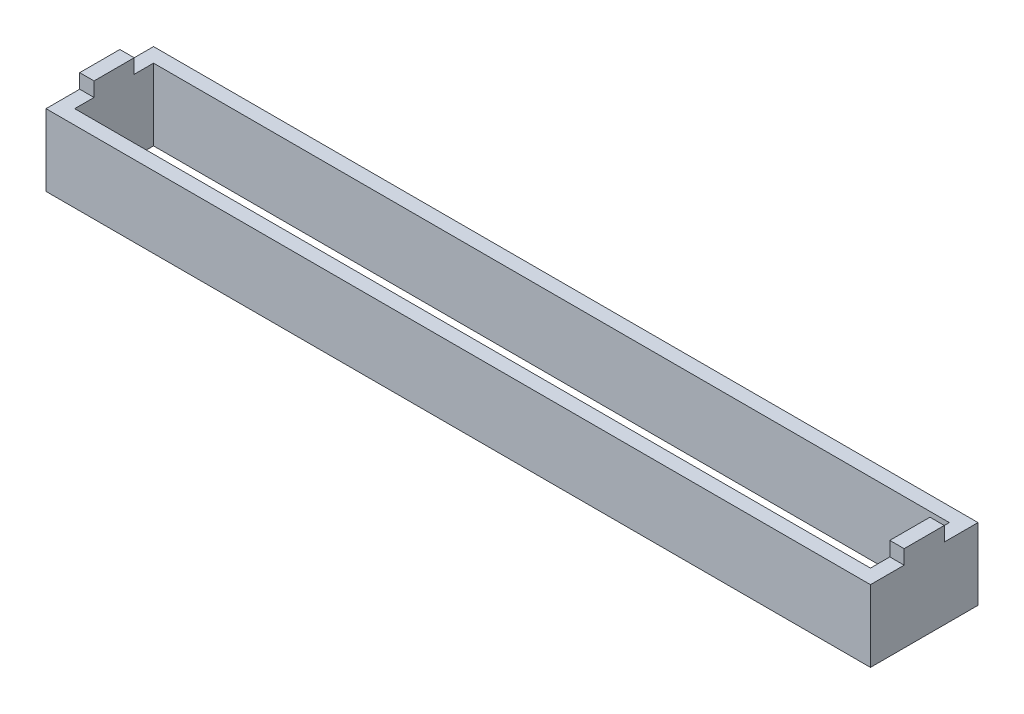
ISO-10303-21;
HEADER;
FILE_DESCRIPTION(('STEP AP214'),'2;1');
FILE_NAME('part.step','',(''),(''),'','','');
FILE_SCHEMA(('AUTOMOTIVE_DESIGN { 1 0 10303 214 1 1 1 1 }'));
ENDSEC;
DATA;
#1=APPLICATION_CONTEXT('core data for automotive mechanical design processes');
#2=APPLICATION_PROTOCOL_DEFINITION('international standard','automotive_design',2000,#1);
#3=PRODUCT_CONTEXT('',#1,'mechanical');
#4=PRODUCT('Part','Part','',(#3));
#5=PRODUCT_RELATED_PRODUCT_CATEGORY('part','',(#4));
#6=PRODUCT_DEFINITION_FORMATION('','',#4);
#7=PRODUCT_DEFINITION_CONTEXT('part definition',#1,'design');
#8=PRODUCT_DEFINITION('design','',#6,#7);
#9=PRODUCT_DEFINITION_SHAPE('','',#8);
#10=(LENGTH_UNIT() NAMED_UNIT(*) SI_UNIT(.MILLI.,.METRE.));
#11=(NAMED_UNIT(*) PLANE_ANGLE_UNIT() SI_UNIT($,.RADIAN.));
#12=(NAMED_UNIT(*) SI_UNIT($,.STERADIAN.) SOLID_ANGLE_UNIT());
#13=UNCERTAINTY_MEASURE_WITH_UNIT(LENGTH_MEASURE(1.E-05),#10,'distance_accuracy_value','');
#14=(GEOMETRIC_REPRESENTATION_CONTEXT(3) GLOBAL_UNCERTAINTY_ASSIGNED_CONTEXT((#13)) GLOBAL_UNIT_ASSIGNED_CONTEXT((#10,
#11,#12)) REPRESENTATION_CONTEXT('',''));
#15=CARTESIAN_POINT('',(0.,0.,0.));
#16=DIRECTION('',(0.,0.,1.));
#17=DIRECTION('',(1.,0.,0.));
#18=AXIS2_PLACEMENT_3D('',#15,#16,#17);
#19=CARTESIAN_POINT('',(0.,10.,0.));
#20=DIRECTION('',(0.,-1.,0.));
#21=DIRECTION('',(0.,0.,-1.));
#22=AXIS2_PLACEMENT_3D('',#19,#20,#21);
#23=PLANE('',#22);
#24=DIRECTION('',(1.,0.,0.));
#25=VECTOR('',#24,1.);
#26=CARTESIAN_POINT('',(55.5,10.,2.8));
#27=LINE('',#26,#25);
#28=CARTESIAN_POINT('',(55.5,10.,2.8));
#29=VERTEX_POINT('',#28);
#30=CARTESIAN_POINT('',(57.5,10.,2.8));
#31=VERTEX_POINT('',#30);
#32=EDGE_CURVE('E283',#29,#31,#27,.T.);
#33=ORIENTED_EDGE('',*,*,#32,.F.);
#34=DIRECTION('',(0.,0.,-1.));
#35=VECTOR('',#34,1.);
#36=CARTESIAN_POINT('',(55.5,10.,5.5));
#37=LINE('',#36,#35);
#38=CARTESIAN_POINT('',(55.5,10.,5.5));
#39=VERTEX_POINT('',#38);
#40=EDGE_CURVE('E174',#39,#29,#37,.T.);
#41=ORIENTED_EDGE('',*,*,#40,.F.);
#42=DIRECTION('',(1.,0.,0.));
#43=VECTOR('',#42,1.);
#44=CARTESIAN_POINT('',(-55.5,10.,5.5));
#45=LINE('',#44,#43);
#46=CARTESIAN_POINT('',(-55.5,10.,5.5));
#47=VERTEX_POINT('',#46);
#48=EDGE_CURVE('E213',#47,#39,#45,.T.);
#49=ORIENTED_EDGE('',*,*,#48,.F.);
#50=DIRECTION('',(0.,0.,1.));
#51=VECTOR('',#50,1.);
#52=CARTESIAN_POINT('',(-55.5,10.,5.5));
#53=LINE('',#52,#51);
#54=CARTESIAN_POINT('',(-55.5,10.,2.8));
#55=VERTEX_POINT('',#54);
#56=EDGE_CURVE('E210',#55,#47,#53,.T.);
#57=ORIENTED_EDGE('',*,*,#56,.F.);
#58=DIRECTION('',(1.,0.,0.));
#59=VECTOR('',#58,1.);
#60=CARTESIAN_POINT('',(-57.5,10.,2.8));
#61=LINE('',#60,#59);
#62=CARTESIAN_POINT('',(-57.5,10.,2.8));
#63=VERTEX_POINT('',#62);
#64=EDGE_CURVE('E175',#63,#55,#61,.T.);
#65=ORIENTED_EDGE('',*,*,#64,.F.);
#66=DIRECTION('',(0.,0.,1.));
#67=VECTOR('',#66,1.);
#68=CARTESIAN_POINT('',(-57.5,10.,7.5));
#69=LINE('',#68,#67);
#70=CARTESIAN_POINT('',(-57.5,10.,7.5));
#71=VERTEX_POINT('',#70);
#72=EDGE_CURVE('E243',#63,#71,#69,.T.);
#73=ORIENTED_EDGE('',*,*,#72,.T.);
#74=DIRECTION('',(1.,0.,0.));
#75=VECTOR('',#74,1.);
#76=CARTESIAN_POINT('',(-57.5,10.,7.5));
#77=LINE('',#76,#75);
#78=CARTESIAN_POINT('',(57.5,10.,7.5));
#79=VERTEX_POINT('',#78);
#80=EDGE_CURVE('E246',#71,#79,#77,.T.);
#81=ORIENTED_EDGE('',*,*,#80,.T.);
#82=DIRECTION('',(0.,0.,-1.));
#83=VECTOR('',#82,1.);
#84=CARTESIAN_POINT('',(57.5,10.,7.5));
#85=LINE('',#84,#83);
#86=EDGE_CURVE('E237',#79,#31,#85,.T.);
#87=ORIENTED_EDGE('',*,*,#86,.T.);
#88=EDGE_LOOP('',(#33,#41,#49,#57,#65,#73,#81,#87));
#89=FACE_BOUND('',#88,.T.);
#90=ADVANCED_FACE('F38',(#89),#23,.F.);
#91=DIRECTION('',(-1.,0.,0.));
#92=VECTOR('',#91,1.);
#93=CARTESIAN_POINT('',(55.5,10.,-2.8));
#94=LINE('',#93,#92);
#95=CARTESIAN_POINT('',(57.5,10.,-2.8));
#96=VERTEX_POINT('',#95);
#97=CARTESIAN_POINT('',(55.5,10.,-2.8));
#98=VERTEX_POINT('',#97);
#99=EDGE_CURVE('E168',#96,#98,#94,.T.);
#100=ORIENTED_EDGE('',*,*,#99,.F.);
#101=CARTESIAN_POINT('',(57.5,10.,-7.5));
#102=VERTEX_POINT('',#101);
#103=EDGE_CURVE('E241',#96,#102,#85,.T.);
#104=ORIENTED_EDGE('',*,*,#103,.T.);
#105=DIRECTION('',(-1.,0.,0.));
#106=VECTOR('',#105,1.);
#107=CARTESIAN_POINT('',(-57.5,10.,-7.5));
#108=LINE('',#107,#106);
#109=CARTESIAN_POINT('',(-57.5,10.,-7.5));
#110=VERTEX_POINT('',#109);
#111=EDGE_CURVE('E240',#102,#110,#108,.T.);
#112=ORIENTED_EDGE('',*,*,#111,.T.);
#113=CARTESIAN_POINT('',(-57.5,10.,-2.8));
#114=VERTEX_POINT('',#113);
#115=EDGE_CURVE('E244',#110,#114,#69,.T.);
#116=ORIENTED_EDGE('',*,*,#115,.T.);
#117=DIRECTION('',(-1.,0.,0.));
#118=VECTOR('',#117,1.);
#119=CARTESIAN_POINT('',(-57.5,10.,-2.8));
#120=LINE('',#119,#118);
#121=CARTESIAN_POINT('',(-55.5,10.,-2.8));
#122=VERTEX_POINT('',#121);
#123=EDGE_CURVE('E61',#122,#114,#120,.T.);
#124=ORIENTED_EDGE('',*,*,#123,.F.);
#125=CARTESIAN_POINT('',(-55.5,10.,-5.5));
#126=VERTEX_POINT('',#125);
#127=EDGE_CURVE('E211',#126,#122,#53,.T.);
#128=ORIENTED_EDGE('',*,*,#127,.F.);
#129=DIRECTION('',(-1.,0.,0.));
#130=VECTOR('',#129,1.);
#131=CARTESIAN_POINT('',(-55.5,10.,-5.5));
#132=LINE('',#131,#130);
#133=CARTESIAN_POINT('',(55.5,10.,-5.5));
#134=VERTEX_POINT('',#133);
#135=EDGE_CURVE('E207',#134,#126,#132,.T.);
#136=ORIENTED_EDGE('',*,*,#135,.F.);
#137=EDGE_CURVE('E208',#98,#134,#37,.T.);
#138=ORIENTED_EDGE('',*,*,#137,.F.);
#139=EDGE_LOOP('',(#100,#104,#112,#116,#124,#128,#136,#138));
#140=FACE_BOUND('',#139,.T.);
#141=ADVANCED_FACE('F304',(#140),#23,.F.);
#142=CARTESIAN_POINT('',(0.,0.,0.));
#143=DIRECTION('',(0.,-1.,0.));
#144=DIRECTION('',(0.,0.,-1.));
#145=AXIS2_PLACEMENT_3D('',#142,#143,#144);
#146=PLANE('',#145);
#147=DIRECTION('',(0.,0.,-1.));
#148=VECTOR('',#147,1.);
#149=CARTESIAN_POINT('',(57.5,0.,7.5));
#150=LINE('',#149,#148);
#151=CARTESIAN_POINT('',(57.5,0.,7.5));
#152=VERTEX_POINT('',#151);
#153=CARTESIAN_POINT('',(57.5,0.,-7.5));
#154=VERTEX_POINT('',#153);
#155=EDGE_CURVE('E236',#152,#154,#150,.T.);
#156=ORIENTED_EDGE('',*,*,#155,.F.);
#157=DIRECTION('',(1.,0.,0.));
#158=VECTOR('',#157,1.);
#159=CARTESIAN_POINT('',(-57.5,0.,7.5));
#160=LINE('',#159,#158);
#161=CARTESIAN_POINT('',(-57.5,0.,7.5));
#162=VERTEX_POINT('',#161);
#163=EDGE_CURVE('E255',#162,#152,#160,.T.);
#164=ORIENTED_EDGE('',*,*,#163,.F.);
#165=DIRECTION('',(0.,0.,1.));
#166=VECTOR('',#165,1.);
#167=CARTESIAN_POINT('',(-57.5,0.,7.5));
#168=LINE('',#167,#166);
#169=CARTESIAN_POINT('',(-57.5,0.,-7.5));
#170=VERTEX_POINT('',#169);
#171=EDGE_CURVE('E253',#170,#162,#168,.T.);
#172=ORIENTED_EDGE('',*,*,#171,.F.);
#173=DIRECTION('',(-1.,0.,0.));
#174=VECTOR('',#173,1.);
#175=CARTESIAN_POINT('',(-57.5,0.,-7.5));
#176=LINE('',#175,#174);
#177=EDGE_CURVE('E251',#154,#170,#176,.T.);
#178=ORIENTED_EDGE('',*,*,#177,.F.);
#179=EDGE_LOOP('',(#156,#164,#172,#178));
#180=FACE_BOUND('',#179,.T.);
#181=DIRECTION('',(1.,0.,0.));
#182=VECTOR('',#181,1.);
#183=CARTESIAN_POINT('',(-55.5,0.,5.5));
#184=LINE('',#183,#182);
#185=CARTESIAN_POINT('',(-55.5,0.,5.5));
#186=VERTEX_POINT('',#185);
#187=CARTESIAN_POINT('',(55.5,0.,5.5));
#188=VERTEX_POINT('',#187);
#189=EDGE_CURVE('E224',#186,#188,#184,.T.);
#190=ORIENTED_EDGE('',*,*,#189,.T.);
#191=DIRECTION('',(0.,0.,-1.));
#192=VECTOR('',#191,1.);
#193=CARTESIAN_POINT('',(55.5,0.,5.5));
#194=LINE('',#193,#192);
#195=CARTESIAN_POINT('',(55.5,0.,-5.5));
#196=VERTEX_POINT('',#195);
#197=EDGE_CURVE('E205',#188,#196,#194,.T.);
#198=ORIENTED_EDGE('',*,*,#197,.T.);
#199=DIRECTION('',(-1.,0.,0.));
#200=VECTOR('',#199,1.);
#201=CARTESIAN_POINT('',(-55.5,0.,-5.5));
#202=LINE('',#201,#200);
#203=CARTESIAN_POINT('',(-55.5,0.,-5.5));
#204=VERTEX_POINT('',#203);
#205=EDGE_CURVE('E218',#196,#204,#202,.T.);
#206=ORIENTED_EDGE('',*,*,#205,.T.);
#207=DIRECTION('',(0.,0.,1.));
#208=VECTOR('',#207,1.);
#209=CARTESIAN_POINT('',(-55.5,0.,5.5));
#210=LINE('',#209,#208);
#211=EDGE_CURVE('E221',#204,#186,#210,.T.);
#212=ORIENTED_EDGE('',*,*,#211,.T.);
#213=EDGE_LOOP('',(#190,#198,#206,#212));
#214=FACE_BOUND('',#213,.T.);
#215=ADVANCED_FACE('F273',(#180,#214),#146,.T.);
#216=CARTESIAN_POINT('',(57.5,10.,7.5));
#217=DIRECTION('',(-1.,0.,0.));
#218=DIRECTION('',(0.,0.,1.));
#219=AXIS2_PLACEMENT_3D('',#216,#217,#218);
#220=PLANE('',#219);
#221=ORIENTED_EDGE('',*,*,#155,.T.);
#222=DIRECTION('',(0.,-1.,0.));
#223=VECTOR('',#222,1.);
#224=CARTESIAN_POINT('',(57.5,10.,-7.5));
#225=LINE('',#224,#223);
#226=EDGE_CURVE('E11',#102,#154,#225,.T.);
#227=ORIENTED_EDGE('',*,*,#226,.F.);
#228=ORIENTED_EDGE('',*,*,#103,.F.);
#229=DIRECTION('',(0.,-1.,0.));
#230=VECTOR('',#229,1.);
#231=CARTESIAN_POINT('',(57.5,12.,-2.8));
#232=LINE('',#231,#230);
#233=CARTESIAN_POINT('',(57.5,12.,-2.8));
#234=VERTEX_POINT('',#233);
#235=EDGE_CURVE('E179',#234,#96,#232,.T.);
#236=ORIENTED_EDGE('',*,*,#235,.F.);
#237=DIRECTION('',(0.,0.,-1.));
#238=VECTOR('',#237,1.);
#239=CARTESIAN_POINT('',(57.5,12.,-2.8));
#240=LINE('',#239,#238);
#241=CARTESIAN_POINT('',(57.5,12.,2.8));
#242=VERTEX_POINT('',#241);
#243=EDGE_CURVE('E162',#242,#234,#240,.T.);
#244=ORIENTED_EDGE('',*,*,#243,.F.);
#245=DIRECTION('',(0.,-1.,0.));
#246=VECTOR('',#245,1.);
#247=CARTESIAN_POINT('',(57.5,12.,2.8));
#248=LINE('',#247,#246);
#249=EDGE_CURVE('E159',#242,#31,#248,.T.);
#250=ORIENTED_EDGE('',*,*,#249,.T.);
#251=ORIENTED_EDGE('',*,*,#86,.F.);
#252=DIRECTION('',(0.,-1.,0.));
#253=VECTOR('',#252,1.);
#254=CARTESIAN_POINT('',(57.5,10.,7.5));
#255=LINE('',#254,#253);
#256=EDGE_CURVE('E248',#79,#152,#255,.T.);
#257=ORIENTED_EDGE('',*,*,#256,.T.);
#258=EDGE_LOOP('',(#221,#227,#228,#236,#244,#250,#251,#257));
#259=FACE_BOUND('',#258,.T.);
#260=ADVANCED_FACE('F40',(#259),#220,.F.);
#261=CARTESIAN_POINT('',(-57.5,10.,-7.5));
#262=DIRECTION('',(0.,0.,1.));
#263=DIRECTION('',(1.,0.,0.));
#264=AXIS2_PLACEMENT_3D('',#261,#262,#263);
#265=PLANE('',#264);
#266=ORIENTED_EDGE('',*,*,#177,.T.);
#267=DIRECTION('',(0.,-1.,0.));
#268=VECTOR('',#267,1.);
#269=CARTESIAN_POINT('',(-57.5,10.,-7.5));
#270=LINE('',#269,#268);
#271=EDGE_CURVE('E46',#110,#170,#270,.T.);
#272=ORIENTED_EDGE('',*,*,#271,.F.);
#273=ORIENTED_EDGE('',*,*,#111,.F.);
#274=ORIENTED_EDGE('',*,*,#226,.T.);
#275=EDGE_LOOP('',(#266,#272,#273,#274));
#276=FACE_BOUND('',#275,.T.);
#277=ADVANCED_FACE('F335',(#276),#265,.F.);
#278=CARTESIAN_POINT('',(-57.5,10.,7.5));
#279=DIRECTION('',(1.,0.,0.));
#280=DIRECTION('',(0.,0.,-1.));
#281=AXIS2_PLACEMENT_3D('',#278,#279,#280);
#282=PLANE('',#281);
#283=ORIENTED_EDGE('',*,*,#171,.T.);
#284=DIRECTION('',(0.,-1.,0.));
#285=VECTOR('',#284,1.);
#286=CARTESIAN_POINT('',(-57.5,10.,7.5));
#287=LINE('',#286,#285);
#288=EDGE_CURVE('E259',#71,#162,#287,.T.);
#289=ORIENTED_EDGE('',*,*,#288,.F.);
#290=ORIENTED_EDGE('',*,*,#72,.F.);
#291=DIRECTION('',(0.,-1.,0.));
#292=VECTOR('',#291,1.);
#293=CARTESIAN_POINT('',(-57.5,12.,2.8));
#294=LINE('',#293,#292);
#295=CARTESIAN_POINT('',(-57.5,12.,2.8));
#296=VERTEX_POINT('',#295);
#297=EDGE_CURVE('E202',#296,#63,#294,.T.);
#298=ORIENTED_EDGE('',*,*,#297,.F.);
#299=DIRECTION('',(0.,0.,1.));
#300=VECTOR('',#299,1.);
#301=CARTESIAN_POINT('',(-57.5,12.,2.8));
#302=LINE('',#301,#300);
#303=CARTESIAN_POINT('',(-57.5,12.,-2.8));
#304=VERTEX_POINT('',#303);
#305=EDGE_CURVE('E183',#304,#296,#302,.T.);
#306=ORIENTED_EDGE('',*,*,#305,.F.);
#307=DIRECTION('',(0.,-1.,0.));
#308=VECTOR('',#307,1.);
#309=CARTESIAN_POINT('',(-57.5,12.,-2.8));
#310=LINE('',#309,#308);
#311=EDGE_CURVE('E191',#304,#114,#310,.T.);
#312=ORIENTED_EDGE('',*,*,#311,.T.);
#313=ORIENTED_EDGE('',*,*,#115,.F.);
#314=ORIENTED_EDGE('',*,*,#271,.T.);
#315=EDGE_LOOP('',(#283,#289,#290,#298,#306,#312,#313,#314));
#316=FACE_BOUND('',#315,.T.);
#317=ADVANCED_FACE('F266',(#316),#282,.F.);
#318=CARTESIAN_POINT('',(-57.5,10.,7.5));
#319=DIRECTION('',(0.,0.,-1.));
#320=DIRECTION('',(-1.,0.,0.));
#321=AXIS2_PLACEMENT_3D('',#318,#319,#320);
#322=PLANE('',#321);
#323=ORIENTED_EDGE('',*,*,#163,.T.);
#324=ORIENTED_EDGE('',*,*,#256,.F.);
#325=ORIENTED_EDGE('',*,*,#80,.F.);
#326=ORIENTED_EDGE('',*,*,#288,.T.);
#327=EDGE_LOOP('',(#323,#324,#325,#326));
#328=FACE_BOUND('',#327,.T.);
#329=ADVANCED_FACE('F277',(#328),#322,.F.);
#330=CARTESIAN_POINT('',(55.5,10.,5.5));
#331=DIRECTION('',(-1.,0.,0.));
#332=DIRECTION('',(0.,0.,1.));
#333=AXIS2_PLACEMENT_3D('',#330,#331,#332);
#334=PLANE('',#333);
#335=ORIENTED_EDGE('',*,*,#197,.F.);
#336=DIRECTION('',(0.,-1.,0.));
#337=VECTOR('',#336,1.);
#338=CARTESIAN_POINT('',(55.5,10.,5.5));
#339=LINE('',#338,#337);
#340=EDGE_CURVE('E215',#39,#188,#339,.T.);
#341=ORIENTED_EDGE('',*,*,#340,.F.);
#342=ORIENTED_EDGE('',*,*,#40,.T.);
#343=DIRECTION('',(0.,-1.,0.));
#344=VECTOR('',#343,1.);
#345=CARTESIAN_POINT('',(55.5,12.,2.8));
#346=LINE('',#345,#344);
#347=CARTESIAN_POINT('',(55.5,12.,2.8));
#348=VERTEX_POINT('',#347);
#349=EDGE_CURVE('E156',#348,#29,#346,.T.);
#350=ORIENTED_EDGE('',*,*,#349,.F.);
#351=DIRECTION('',(0.,0.,1.));
#352=VECTOR('',#351,1.);
#353=CARTESIAN_POINT('',(55.5,12.,-2.8));
#354=LINE('',#353,#352);
#355=CARTESIAN_POINT('',(55.5,12.,-2.8));
#356=VERTEX_POINT('',#355);
#357=EDGE_CURVE('E163',#356,#348,#354,.T.);
#358=ORIENTED_EDGE('',*,*,#357,.F.);
#359=DIRECTION('',(0.,-1.,0.));
#360=VECTOR('',#359,1.);
#361=CARTESIAN_POINT('',(55.5,12.,-2.8));
#362=LINE('',#361,#360);
#363=EDGE_CURVE('E53',#356,#98,#362,.T.);
#364=ORIENTED_EDGE('',*,*,#363,.T.);
#365=ORIENTED_EDGE('',*,*,#137,.T.);
#366=DIRECTION('',(0.,-1.,0.));
#367=VECTOR('',#366,1.);
#368=CARTESIAN_POINT('',(55.5,10.,-5.5));
#369=LINE('',#368,#367);
#370=EDGE_CURVE('E233',#134,#196,#369,.T.);
#371=ORIENTED_EDGE('',*,*,#370,.T.);
#372=EDGE_LOOP('',(#335,#341,#342,#350,#358,#364,#365,#371));
#373=FACE_BOUND('',#372,.T.);
#374=ADVANCED_FACE('F171',(#373),#334,.T.);
#375=CARTESIAN_POINT('',(-55.5,10.,-5.5));
#376=DIRECTION('',(0.,0.,1.));
#377=DIRECTION('',(1.,0.,0.));
#378=AXIS2_PLACEMENT_3D('',#375,#376,#377);
#379=PLANE('',#378);
#380=ORIENTED_EDGE('',*,*,#205,.F.);
#381=ORIENTED_EDGE('',*,*,#370,.F.);
#382=ORIENTED_EDGE('',*,*,#135,.T.);
#383=DIRECTION('',(0.,-1.,0.));
#384=VECTOR('',#383,1.);
#385=CARTESIAN_POINT('',(-55.5,10.,-5.5));
#386=LINE('',#385,#384);
#387=EDGE_CURVE('E231',#126,#204,#386,.T.);
#388=ORIENTED_EDGE('',*,*,#387,.T.);
#389=EDGE_LOOP('',(#380,#381,#382,#388));
#390=FACE_BOUND('',#389,.T.);
#391=ADVANCED_FACE('F308',(#390),#379,.T.);
#392=CARTESIAN_POINT('',(-55.5,10.,5.5));
#393=DIRECTION('',(1.,0.,0.));
#394=DIRECTION('',(0.,0.,-1.));
#395=AXIS2_PLACEMENT_3D('',#392,#393,#394);
#396=PLANE('',#395);
#397=ORIENTED_EDGE('',*,*,#211,.F.);
#398=ORIENTED_EDGE('',*,*,#387,.F.);
#399=ORIENTED_EDGE('',*,*,#127,.T.);
#400=DIRECTION('',(0.,-1.,0.));
#401=VECTOR('',#400,1.);
#402=CARTESIAN_POINT('',(-55.5,12.,-2.8));
#403=LINE('',#402,#401);
#404=CARTESIAN_POINT('',(-55.5,12.,-2.8));
#405=VERTEX_POINT('',#404);
#406=EDGE_CURVE('E196',#405,#122,#403,.T.);
#407=ORIENTED_EDGE('',*,*,#406,.F.);
#408=DIRECTION('',(0.,0.,-1.));
#409=VECTOR('',#408,1.);
#410=CARTESIAN_POINT('',(-55.5,12.,2.8));
#411=LINE('',#410,#409);
#412=CARTESIAN_POINT('',(-55.5,12.,2.8));
#413=VERTEX_POINT('',#412);
#414=EDGE_CURVE('E188',#413,#405,#411,.T.);
#415=ORIENTED_EDGE('',*,*,#414,.F.);
#416=DIRECTION('',(0.,-1.,0.));
#417=VECTOR('',#416,1.);
#418=CARTESIAN_POINT('',(-55.5,12.,2.8));
#419=LINE('',#418,#417);
#420=EDGE_CURVE('E199',#413,#55,#419,.T.);
#421=ORIENTED_EDGE('',*,*,#420,.T.);
#422=ORIENTED_EDGE('',*,*,#56,.T.);
#423=DIRECTION('',(0.,-1.,0.));
#424=VECTOR('',#423,1.);
#425=CARTESIAN_POINT('',(-55.5,10.,5.5));
#426=LINE('',#425,#424);
#427=EDGE_CURVE('E229',#47,#186,#426,.T.);
#428=ORIENTED_EDGE('',*,*,#427,.T.);
#429=EDGE_LOOP('',(#397,#398,#399,#407,#415,#421,#422,#428));
#430=FACE_BOUND('',#429,.T.);
#431=ADVANCED_FACE('F300',(#430),#396,.T.);
#432=CARTESIAN_POINT('',(-55.5,10.,5.5));
#433=DIRECTION('',(0.,0.,-1.));
#434=DIRECTION('',(-1.,0.,0.));
#435=AXIS2_PLACEMENT_3D('',#432,#433,#434);
#436=PLANE('',#435);
#437=ORIENTED_EDGE('',*,*,#189,.F.);
#438=ORIENTED_EDGE('',*,*,#427,.F.);
#439=ORIENTED_EDGE('',*,*,#48,.T.);
#440=ORIENTED_EDGE('',*,*,#340,.T.);
#441=EDGE_LOOP('',(#437,#438,#439,#440));
#442=FACE_BOUND('',#441,.T.);
#443=ADVANCED_FACE('F312',(#442),#436,.T.);
#444=CARTESIAN_POINT('',(-57.5,12.,2.8));
#445=DIRECTION('',(0.,0.,-1.));
#446=DIRECTION('',(-1.,0.,0.));
#447=AXIS2_PLACEMENT_3D('',#444,#445,#446);
#448=PLANE('',#447);
#449=ORIENTED_EDGE('',*,*,#64,.T.);
#450=ORIENTED_EDGE('',*,*,#420,.F.);
#451=DIRECTION('',(1.,0.,0.));
#452=VECTOR('',#451,1.);
#453=CARTESIAN_POINT('',(-57.5,12.,2.8));
#454=LINE('',#453,#452);
#455=EDGE_CURVE('E186',#296,#413,#454,.T.);
#456=ORIENTED_EDGE('',*,*,#455,.F.);
#457=ORIENTED_EDGE('',*,*,#297,.T.);
#458=EDGE_LOOP('',(#449,#450,#456,#457));
#459=FACE_BOUND('',#458,.T.);
#460=ADVANCED_FACE('F288',(#459),#448,.F.);
#461=CARTESIAN_POINT('',(-57.5,12.,-2.8));
#462=DIRECTION('',(0.,0.,1.));
#463=DIRECTION('',(1.,0.,0.));
#464=AXIS2_PLACEMENT_3D('',#461,#462,#463);
#465=PLANE('',#464);
#466=ORIENTED_EDGE('',*,*,#123,.T.);
#467=ORIENTED_EDGE('',*,*,#311,.F.);
#468=DIRECTION('',(-1.,0.,0.));
#469=VECTOR('',#468,1.);
#470=CARTESIAN_POINT('',(-57.5,12.,-2.8));
#471=LINE('',#470,#469);
#472=EDGE_CURVE('E190',#405,#304,#471,.T.);
#473=ORIENTED_EDGE('',*,*,#472,.F.);
#474=ORIENTED_EDGE('',*,*,#406,.T.);
#475=EDGE_LOOP('',(#466,#467,#473,#474));
#476=FACE_BOUND('',#475,.T.);
#477=ADVANCED_FACE('F296',(#476),#465,.F.);
#478=CARTESIAN_POINT('',(0.,12.,0.));
#479=DIRECTION('',(0.,-1.,0.));
#480=DIRECTION('',(0.,0.,-1.));
#481=AXIS2_PLACEMENT_3D('',#478,#479,#480);
#482=PLANE('',#481);
#483=ORIENTED_EDGE('',*,*,#305,.T.);
#484=ORIENTED_EDGE('',*,*,#455,.T.);
#485=ORIENTED_EDGE('',*,*,#414,.T.);
#486=ORIENTED_EDGE('',*,*,#472,.T.);
#487=EDGE_LOOP('',(#483,#484,#485,#486));
#488=FACE_BOUND('',#487,.T.);
#489=ADVANCED_FACE('F292',(#488),#482,.F.);
#490=CARTESIAN_POINT('',(55.5,12.,2.8));
#491=DIRECTION('',(0.,0.,-1.));
#492=DIRECTION('',(-1.,0.,0.));
#493=AXIS2_PLACEMENT_3D('',#490,#491,#492);
#494=PLANE('',#493);
#495=ORIENTED_EDGE('',*,*,#32,.T.);
#496=ORIENTED_EDGE('',*,*,#249,.F.);
#497=DIRECTION('',(1.,0.,0.));
#498=VECTOR('',#497,1.);
#499=CARTESIAN_POINT('',(55.5,12.,2.8));
#500=LINE('',#499,#498);
#501=EDGE_CURVE('E152',#348,#242,#500,.T.);
#502=ORIENTED_EDGE('',*,*,#501,.F.);
#503=ORIENTED_EDGE('',*,*,#349,.T.);
#504=EDGE_LOOP('',(#495,#496,#502,#503));
#505=FACE_BOUND('',#504,.T.);
#506=ADVANCED_FACE('F154',(#505),#494,.F.);
#507=CARTESIAN_POINT('',(55.5,12.,-2.8));
#508=DIRECTION('',(0.,0.,1.));
#509=DIRECTION('',(1.,0.,0.));
#510=AXIS2_PLACEMENT_3D('',#507,#508,#509);
#511=PLANE('',#510);
#512=ORIENTED_EDGE('',*,*,#99,.T.);
#513=ORIENTED_EDGE('',*,*,#363,.F.);
#514=DIRECTION('',(-1.,0.,0.));
#515=VECTOR('',#514,1.);
#516=CARTESIAN_POINT('',(55.5,12.,-2.8));
#517=LINE('',#516,#515);
#518=EDGE_CURVE('E167',#234,#356,#517,.T.);
#519=ORIENTED_EDGE('',*,*,#518,.F.);
#520=ORIENTED_EDGE('',*,*,#235,.T.);
#521=EDGE_LOOP('',(#512,#513,#519,#520));
#522=FACE_BOUND('',#521,.T.);
#523=ADVANCED_FACE('F347',(#522),#511,.F.);
#524=CARTESIAN_POINT('',(0.,12.,0.));
#525=DIRECTION('',(0.,1.,0.));
#526=DIRECTION('',(0.,0.,1.));
#527=AXIS2_PLACEMENT_3D('',#524,#525,#526);
#528=PLANE('',#527);
#529=ORIENTED_EDGE('',*,*,#357,.T.);
#530=ORIENTED_EDGE('',*,*,#501,.T.);
#531=ORIENTED_EDGE('',*,*,#243,.T.);
#532=ORIENTED_EDGE('',*,*,#518,.T.);
#533=EDGE_LOOP('',(#529,#530,#531,#532));
#534=FACE_BOUND('',#533,.T.);
#535=ADVANCED_FACE('F165',(#534),#528,.T.);
#536=CLOSED_SHELL('',(#90,#141,#215,#260,#277,#317,#329,#374,#391,#431,#443,#460,#477,#489,#506,
#523,#535));
#537=MANIFOLD_SOLID_BREP('B2',#536);
#538=ADVANCED_BREP_SHAPE_REPRESENTATION('',(#18,#537),#14);
#539=SHAPE_DEFINITION_REPRESENTATION(#9,#538);
ENDSEC;
END-ISO-10303-21;
